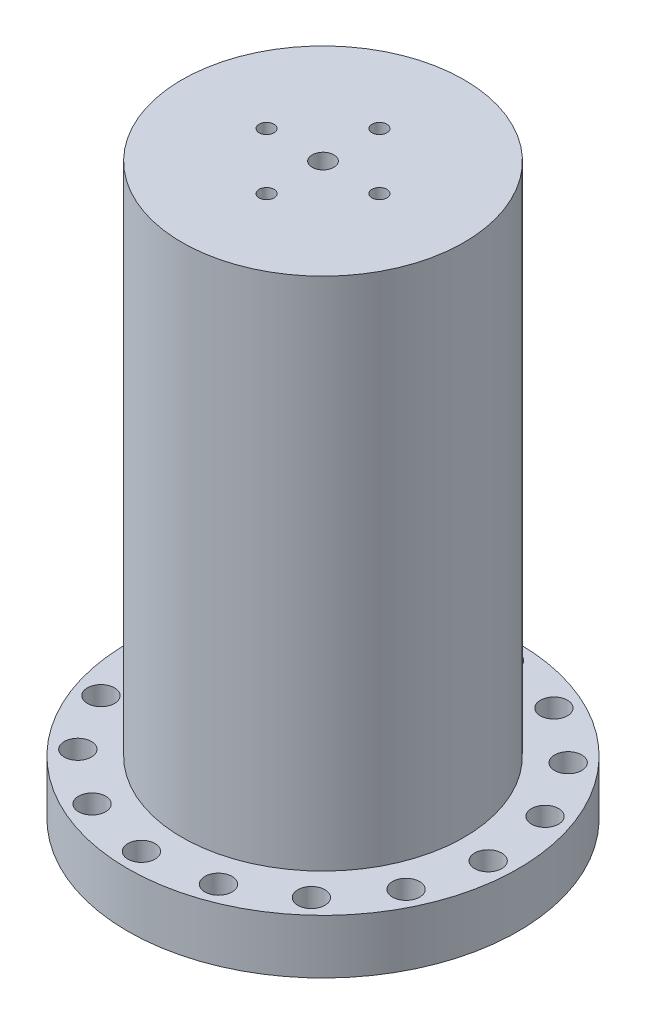
ISO-10303-21;
HEADER;
FILE_DESCRIPTION(('STEP AP214'),'2;1');
FILE_NAME('part.step','',(''),(''),'','','');
FILE_SCHEMA(('AUTOMOTIVE_DESIGN { 1 0 10303 214 1 1 1 1 }'));
ENDSEC;
DATA;
#1=APPLICATION_CONTEXT('core data for automotive mechanical design processes');
#2=APPLICATION_PROTOCOL_DEFINITION('international standard','automotive_design',2000,#1);
#3=PRODUCT_CONTEXT('',#1,'mechanical');
#4=PRODUCT('Part','Part','',(#3));
#5=PRODUCT_RELATED_PRODUCT_CATEGORY('part','',(#4));
#6=PRODUCT_DEFINITION_FORMATION('','',#4);
#7=PRODUCT_DEFINITION_CONTEXT('part definition',#1,'design');
#8=PRODUCT_DEFINITION('design','',#6,#7);
#9=PRODUCT_DEFINITION_SHAPE('','',#8);
#10=(LENGTH_UNIT() NAMED_UNIT(*) SI_UNIT(.MILLI.,.METRE.));
#11=(NAMED_UNIT(*) PLANE_ANGLE_UNIT() SI_UNIT($,.RADIAN.));
#12=(NAMED_UNIT(*) SI_UNIT($,.STERADIAN.) SOLID_ANGLE_UNIT());
#13=UNCERTAINTY_MEASURE_WITH_UNIT(LENGTH_MEASURE(1.E-05),#10,'distance_accuracy_value','');
#14=(GEOMETRIC_REPRESENTATION_CONTEXT(3) GLOBAL_UNCERTAINTY_ASSIGNED_CONTEXT((#13)) GLOBAL_UNIT_ASSIGNED_CONTEXT((#10,
#11,#12)) REPRESENTATION_CONTEXT('',''));
#15=CARTESIAN_POINT('',(0.,0.,0.));
#16=DIRECTION('',(0.,0.,1.));
#17=DIRECTION('',(1.,0.,0.));
#18=AXIS2_PLACEMENT_3D('',#15,#16,#17);
#19=CARTESIAN_POINT('',(0.,5.08,0.));
#20=DIRECTION('',(0.,1.,0.));
#21=DIRECTION('',(0.,0.,1.));
#22=AXIS2_PLACEMENT_3D('',#19,#20,#21);
#23=CYLINDRICAL_SURFACE('',#22,2.54);
#24=CARTESIAN_POINT('',(0.,133.35,0.));
#25=DIRECTION('',(0.,1.,0.));
#26=DIRECTION('',(0.,0.,1.));
#27=AXIS2_PLACEMENT_3D('',#24,#25,#26);
#28=CIRCLE('',#27,2.54);
#29=CARTESIAN_POINT('',(0.,133.35,2.54));
#30=VERTEX_POINT('',#29);
#31=EDGE_CURVE('E57',#30,#30,#28,.T.);
#32=ORIENTED_EDGE('',*,*,#31,.T.);
#33=EDGE_LOOP('',(#32));
#34=FACE_BOUND('',#33,.T.);
#35=CARTESIAN_POINT('',(0.,128.397,0.));
#36=DIRECTION('',(0.,-1.,0.));
#37=DIRECTION('',(0.,0.,-1.));
#38=AXIS2_PLACEMENT_3D('',#35,#36,#37);
#39=CIRCLE('',#38,2.54);
#40=CARTESIAN_POINT('',(0.,128.397,-2.54));
#41=VERTEX_POINT('',#40);
#42=EDGE_CURVE('E37',#41,#41,#39,.F.);
#43=ORIENTED_EDGE('',*,*,#42,.F.);
#44=EDGE_LOOP('',(#43));
#45=FACE_BOUND('',#44,.T.);
#46=ADVANCED_FACE('F33',(#34,#45),#23,.F.);
#47=CARTESIAN_POINT('',(0.,12.7,0.));
#48=DIRECTION('',(0.,-1.,0.));
#49=DIRECTION('',(0.,0.,-1.));
#50=AXIS2_PLACEMENT_3D('',#47,#48,#49);
#51=CYLINDRICAL_SURFACE('',#50,45.72);
#52=CARTESIAN_POINT('',(0.,12.7,0.));
#53=DIRECTION('',(0.,1.,0.));
#54=DIRECTION('',(0.,0.,1.));
#55=AXIS2_PLACEMENT_3D('',#52,#53,#54);
#56=CIRCLE('',#55,45.72);
#57=CARTESIAN_POINT('',(0.,12.7,45.72));
#58=VERTEX_POINT('',#57);
#59=EDGE_CURVE('E10',#58,#58,#56,.T.);
#60=ORIENTED_EDGE('',*,*,#59,.F.);
#61=EDGE_LOOP('',(#60));
#62=FACE_BOUND('',#61,.T.);
#63=CARTESIAN_POINT('',(0.,0.,0.));
#64=DIRECTION('',(0.,1.,0.));
#65=DIRECTION('',(0.,0.,1.));
#66=AXIS2_PLACEMENT_3D('',#63,#64,#65);
#67=CIRCLE('',#66,45.72);
#68=CARTESIAN_POINT('',(0.,0.,45.72));
#69=VERTEX_POINT('',#68);
#70=EDGE_CURVE('E41',#69,#69,#67,.T.);
#71=ORIENTED_EDGE('',*,*,#70,.T.);
#72=EDGE_LOOP('',(#71));
#73=FACE_BOUND('',#72,.T.);
#74=ADVANCED_FACE('F35',(#62,#73),#51,.T.);
#75=CARTESIAN_POINT('',(0.,12.7,0.));
#76=DIRECTION('',(0.,1.,0.));
#77=DIRECTION('',(0.,0.,1.));
#78=AXIS2_PLACEMENT_3D('',#75,#76,#77);
#79=PLANE('',#78);
#80=CARTESIAN_POINT('',(17.3100660208484,12.7,-36.7691611864327));
#81=DIRECTION('',(0.,1.,0.));
#82=DIRECTION('',(0.,0.,1.));
#83=AXIS2_PLACEMENT_3D('',#80,#81,#82);
#84=CIRCLE('',#83,3.175);
#85=CARTESIAN_POINT('',(17.3100660208484,12.7,-33.5941611864327));
#86=VERTEX_POINT('',#85);
#87=EDGE_CURVE('E80',#86,#86,#84,.T.);
#88=ORIENTED_EDGE('',*,*,#87,.F.);
#89=EDGE_LOOP('',(#88));
#90=FACE_BOUND('',#89,.T.);
#91=CARTESIAN_POINT('',(30.0633645110903,12.7,-27.345999968429));
#92=DIRECTION('',(0.,1.,0.));
#93=DIRECTION('',(0.,0.,1.));
#94=AXIS2_PLACEMENT_3D('',#91,#92,#93);
#95=CIRCLE('',#94,3.175);
#96=CARTESIAN_POINT('',(30.0633645110903,12.7,-24.170999968429));
#97=VERTEX_POINT('',#96);
#98=EDGE_CURVE('E83',#97,#97,#95,.T.);
#99=ORIENTED_EDGE('',*,*,#98,.F.);
#100=EDGE_LOOP('',(#99));
#101=FACE_BOUND('',#100,.T.);
#102=CARTESIAN_POINT('',(38.2397882795965,12.7,-13.7596581473389));
#103=DIRECTION('',(0.,1.,0.));
#104=DIRECTION('',(0.,0.,1.));
#105=AXIS2_PLACEMENT_3D('',#102,#103,#104);
#106=CIRCLE('',#105,3.175);
#107=CARTESIAN_POINT('',(38.2397882795965,12.7,-10.5846581473389));
#108=VERTEX_POINT('',#107);
#109=EDGE_CURVE('E86',#108,#108,#106,.T.);
#110=ORIENTED_EDGE('',*,*,#109,.F.);
#111=EDGE_LOOP('',(#110));
#112=FACE_BOUND('',#111,.T.);
#113=CARTESIAN_POINT('',(40.5945509270782,12.7,1.92146689507175));
#114=DIRECTION('',(0.,1.,0.));
#115=DIRECTION('',(0.,0.,1.));
#116=AXIS2_PLACEMENT_3D('',#113,#114,#115);
#117=CIRCLE('',#116,3.175);
#118=CARTESIAN_POINT('',(40.5945509270782,12.7,5.09646689507175));
#119=VERTEX_POINT('',#118);
#120=EDGE_CURVE('E89',#119,#119,#117,.T.);
#121=ORIENTED_EDGE('',*,*,#120,.F.);
#122=EDGE_LOOP('',(#121));
#123=FACE_BOUND('',#122,.T.);
#124=CARTESIAN_POINT('',(36.7691611864326,12.7,17.3100660208485));
#125=DIRECTION('',(0.,1.,0.));
#126=DIRECTION('',(0.,0.,1.));
#127=AXIS2_PLACEMENT_3D('',#124,#125,#126);
#128=CIRCLE('',#127,3.175);
#129=CARTESIAN_POINT('',(36.7691611864326,12.7,20.4850660208485));
#130=VERTEX_POINT('',#129);
#131=EDGE_CURVE('E92',#130,#130,#128,.T.);
#132=ORIENTED_EDGE('',*,*,#131,.F.);
#133=EDGE_LOOP('',(#132));
#134=FACE_BOUND('',#133,.T.);
#135=CARTESIAN_POINT('',(27.3459999684289,12.7,30.0633645110904));
#136=DIRECTION('',(0.,1.,0.));
#137=DIRECTION('',(0.,0.,1.));
#138=AXIS2_PLACEMENT_3D('',#135,#136,#137);
#139=CIRCLE('',#138,3.175);
#140=CARTESIAN_POINT('',(27.3459999684289,12.7,33.2383645110904));
#141=VERTEX_POINT('',#140);
#142=EDGE_CURVE('E95',#141,#141,#139,.T.);
#143=ORIENTED_EDGE('',*,*,#142,.F.);
#144=EDGE_LOOP('',(#143));
#145=FACE_BOUND('',#144,.T.);
#146=CARTESIAN_POINT('',(13.7596581473391,12.7,38.2397882795965));
#147=DIRECTION('',(0.,1.,0.));
#148=DIRECTION('',(0.,0.,1.));
#149=AXIS2_PLACEMENT_3D('',#146,#147,#148);
#150=CIRCLE('',#149,3.175);
#151=CARTESIAN_POINT('',(13.7596581473391,12.7,41.4147882795965));
#152=VERTEX_POINT('',#151);
#153=EDGE_CURVE('E98',#152,#152,#150,.T.);
#154=ORIENTED_EDGE('',*,*,#153,.F.);
#155=EDGE_LOOP('',(#154));
#156=FACE_BOUND('',#155,.T.);
#157=CARTESIAN_POINT('',(-1.92146689507189,12.7,40.5945509270782));
#158=DIRECTION('',(0.,1.,0.));
#159=DIRECTION('',(0.,0.,1.));
#160=AXIS2_PLACEMENT_3D('',#157,#158,#159);
#161=CIRCLE('',#160,3.175);
#162=CARTESIAN_POINT('',(-1.92146689507189,12.7,43.7695509270782));
#163=VERTEX_POINT('',#162);
#164=EDGE_CURVE('E101',#163,#163,#161,.T.);
#165=ORIENTED_EDGE('',*,*,#164,.F.);
#166=EDGE_LOOP('',(#165));
#167=FACE_BOUND('',#166,.T.);
#168=CARTESIAN_POINT('',(-17.3100660208487,12.7,36.7691611864326));
#169=DIRECTION('',(0.,1.,0.));
#170=DIRECTION('',(0.,0.,1.));
#171=AXIS2_PLACEMENT_3D('',#168,#169,#170);
#172=CIRCLE('',#171,3.175);
#173=CARTESIAN_POINT('',(-17.3100660208487,12.7,39.9441611864326));
#174=VERTEX_POINT('',#173);
#175=EDGE_CURVE('E104',#174,#174,#172,.T.);
#176=ORIENTED_EDGE('',*,*,#175,.F.);
#177=EDGE_LOOP('',(#176));
#178=FACE_BOUND('',#177,.T.);
#179=CARTESIAN_POINT('',(-30.0633645110905,12.7,27.3459999684288));
#180=DIRECTION('',(0.,1.,0.));
#181=DIRECTION('',(0.,0.,1.));
#182=AXIS2_PLACEMENT_3D('',#179,#180,#181);
#183=CIRCLE('',#182,3.175);
#184=CARTESIAN_POINT('',(-30.0633645110905,12.7,30.5209999684288));
#185=VERTEX_POINT('',#184);
#186=EDGE_CURVE('E107',#185,#185,#183,.T.);
#187=ORIENTED_EDGE('',*,*,#186,.F.);
#188=EDGE_LOOP('',(#187));
#189=FACE_BOUND('',#188,.T.);
#190=CARTESIAN_POINT('',(-38.2397882795966,12.7,13.7596581473387));
#191=DIRECTION('',(0.,1.,0.));
#192=DIRECTION('',(0.,0.,1.));
#193=AXIS2_PLACEMENT_3D('',#190,#191,#192);
#194=CIRCLE('',#193,3.175);
#195=CARTESIAN_POINT('',(-38.2397882795966,12.7,16.9346581473387));
#196=VERTEX_POINT('',#195);
#197=EDGE_CURVE('E110',#196,#196,#194,.T.);
#198=ORIENTED_EDGE('',*,*,#197,.F.);
#199=EDGE_LOOP('',(#198));
#200=FACE_BOUND('',#199,.T.);
#201=CARTESIAN_POINT('',(-40.5945509270782,12.7,-1.92146689507201));
#202=DIRECTION('',(0.,1.,0.));
#203=DIRECTION('',(0.,0.,1.));
#204=AXIS2_PLACEMENT_3D('',#201,#202,#203);
#205=CIRCLE('',#204,3.175);
#206=CARTESIAN_POINT('',(-40.5945509270782,12.7,1.25353310492799));
#207=VERTEX_POINT('',#206);
#208=EDGE_CURVE('E113',#207,#207,#205,.T.);
#209=ORIENTED_EDGE('',*,*,#208,.F.);
#210=EDGE_LOOP('',(#209));
#211=FACE_BOUND('',#210,.T.);
#212=CARTESIAN_POINT('',(-36.7691611864325,12.7,-17.3100660208488));
#213=DIRECTION('',(0.,1.,0.));
#214=DIRECTION('',(0.,0.,1.));
#215=AXIS2_PLACEMENT_3D('',#212,#213,#214);
#216=CIRCLE('',#215,3.175);
#217=CARTESIAN_POINT('',(-36.7691611864325,12.7,-14.1350660208488));
#218=VERTEX_POINT('',#217);
#219=EDGE_CURVE('E116',#218,#218,#216,.T.);
#220=ORIENTED_EDGE('',*,*,#219,.F.);
#221=EDGE_LOOP('',(#220));
#222=FACE_BOUND('',#221,.T.);
#223=CARTESIAN_POINT('',(-27.3459999684287,12.7,-30.0633645110906));
#224=DIRECTION('',(0.,1.,0.));
#225=DIRECTION('',(0.,0.,1.));
#226=AXIS2_PLACEMENT_3D('',#223,#224,#225);
#227=CIRCLE('',#226,3.175);
#228=CARTESIAN_POINT('',(-27.3459999684287,12.7,-26.8883645110906));
#229=VERTEX_POINT('',#228);
#230=EDGE_CURVE('E119',#229,#229,#227,.T.);
#231=ORIENTED_EDGE('',*,*,#230,.F.);
#232=EDGE_LOOP('',(#231));
#233=FACE_BOUND('',#232,.T.);
#234=CARTESIAN_POINT('',(1.9214668950716,12.7,-40.5945509270782));
#235=DIRECTION('',(0.,1.,0.));
#236=DIRECTION('',(0.,0.,1.));
#237=AXIS2_PLACEMENT_3D('',#234,#235,#236);
#238=CIRCLE('',#237,3.175);
#239=CARTESIAN_POINT('',(1.9214668950716,12.7,-37.4195509270782));
#240=VERTEX_POINT('',#239);
#241=EDGE_CURVE('E72',#240,#240,#238,.T.);
#242=ORIENTED_EDGE('',*,*,#241,.F.);
#243=EDGE_LOOP('',(#242));
#244=FACE_BOUND('',#243,.T.);
#245=CARTESIAN_POINT('',(-13.7596581473391,12.7,-38.2397882795965));
#246=DIRECTION('',(0.,1.,0.));
#247=DIRECTION('',(0.,0.,1.));
#248=AXIS2_PLACEMENT_3D('',#245,#246,#247);
#249=CIRCLE('',#248,3.175);
#250=CARTESIAN_POINT('',(-13.7596581473391,12.7,-35.0647882795965));
#251=VERTEX_POINT('',#250);
#252=EDGE_CURVE('E62',#251,#251,#249,.T.);
#253=ORIENTED_EDGE('',*,*,#252,.F.);
#254=EDGE_LOOP('',(#253));
#255=FACE_BOUND('',#254,.T.);
#256=CARTESIAN_POINT('',(0.,12.7,0.));
#257=DIRECTION('',(0.,1.,0.));
#258=DIRECTION('',(0.,0.,1.));
#259=AXIS2_PLACEMENT_3D('',#256,#257,#258);
#260=CIRCLE('',#259,33.02);
#261=CARTESIAN_POINT('',(0.,12.7,-33.02));
#262=VERTEX_POINT('',#261);
#263=EDGE_CURVE('E48',#262,#262,#260,.T.);
#264=ORIENTED_EDGE('',*,*,#263,.F.);
#265=EDGE_LOOP('',(#264));
#266=FACE_BOUND('',#265,.T.);
#267=ORIENTED_EDGE('',*,*,#59,.T.);
#268=EDGE_LOOP('',(#267));
#269=FACE_BOUND('',#268,.T.);
#270=ADVANCED_FACE('F224',(#90,#101,#112,#123,#134,#145,#156,#167,#178,#189,#200,#211,#222,#233,
#244,#255,#266,#269),#79,.T.);
#271=CARTESIAN_POINT('',(0.,0.,0.));
#272=DIRECTION('',(0.,1.,0.));
#273=DIRECTION('',(0.,0.,1.));
#274=AXIS2_PLACEMENT_3D('',#271,#272,#273);
#275=PLANE('',#274);
#276=CARTESIAN_POINT('',(17.3100660208484,0.,-36.7691611864327));
#277=DIRECTION('',(0.,-1.,0.));
#278=DIRECTION('',(0.707106781186549,0.,-0.707106781186546));
#279=AXIS2_PLACEMENT_3D('',#276,#277,#278);
#280=CIRCLE('',#279,3.175);
#281=CARTESIAN_POINT('',(19.5551300511157,0.,-39.0142252167));
#282=VERTEX_POINT('',#281);
#283=EDGE_CURVE('E122',#282,#282,#280,.T.);
#284=ORIENTED_EDGE('',*,*,#283,.F.);
#285=EDGE_LOOP('',(#284));
#286=FACE_BOUND('',#285,.T.);
#287=CARTESIAN_POINT('',(30.0633645110903,0.,-27.345999968429));
#288=DIRECTION('',(0.,-1.,0.));
#289=DIRECTION('',(0.923879532511288,0.,-0.382683432365087));
#290=AXIS2_PLACEMENT_3D('',#287,#288,#289);
#291=CIRCLE('',#290,3.175);
#292=CARTESIAN_POINT('',(32.9966820268136,0.,-28.5610198661881));
#293=VERTEX_POINT('',#292);
#294=EDGE_CURVE('E160',#293,#293,#291,.T.);
#295=ORIENTED_EDGE('',*,*,#294,.F.);
#296=EDGE_LOOP('',(#295));
#297=FACE_BOUND('',#296,.T.);
#298=CARTESIAN_POINT('',(38.2397882795965,0.,-13.7596581473389));
#299=DIRECTION('',(0.,-1.,0.));
#300=DIRECTION('',(1.,0.,0.));
#301=AXIS2_PLACEMENT_3D('',#298,#299,#300);
#302=CIRCLE('',#301,3.175);
#303=CARTESIAN_POINT('',(41.4147882795965,0.,-13.7596581473389));
#304=VERTEX_POINT('',#303);
#305=EDGE_CURVE('E157',#304,#304,#302,.T.);
#306=ORIENTED_EDGE('',*,*,#305,.F.);
#307=EDGE_LOOP('',(#306));
#308=FACE_BOUND('',#307,.T.);
#309=CARTESIAN_POINT('',(40.5945509270782,0.,1.92146689507175));
#310=DIRECTION('',(0.,-1.,0.));
#311=DIRECTION('',(0.923879532511285,0.,0.382683432365094));
#312=AXIS2_PLACEMENT_3D('',#309,#310,#311);
#313=CIRCLE('',#312,3.175);
#314=CARTESIAN_POINT('',(43.5278684428015,0.,3.13648679283092));
#315=VERTEX_POINT('',#314);
#316=EDGE_CURVE('E154',#315,#315,#313,.T.);
#317=ORIENTED_EDGE('',*,*,#316,.F.);
#318=EDGE_LOOP('',(#317));
#319=FACE_BOUND('',#318,.T.);
#320=CARTESIAN_POINT('',(36.7691611864326,0.,17.3100660208485));
#321=DIRECTION('',(0.,-1.,0.));
#322=DIRECTION('',(0.707106781186544,0.,0.707106781186551));
#323=AXIS2_PLACEMENT_3D('',#320,#321,#322);
#324=CIRCLE('',#323,3.175);
#325=CARTESIAN_POINT('',(39.0142252166999,0.,19.5551300511158));
#326=VERTEX_POINT('',#325);
#327=EDGE_CURVE('E151',#326,#326,#324,.T.);
#328=ORIENTED_EDGE('',*,*,#327,.F.);
#329=EDGE_LOOP('',(#328));
#330=FACE_BOUND('',#329,.T.);
#331=CARTESIAN_POINT('',(27.3459999684289,0.,30.0633645110904));
#332=DIRECTION('',(0.,-1.,0.));
#333=DIRECTION('',(0.382683432365084,0.,0.923879532511289));
#334=AXIS2_PLACEMENT_3D('',#331,#332,#333);
#335=CIRCLE('',#334,3.175);
#336=CARTESIAN_POINT('',(28.561019866188,0.,32.9966820268137));
#337=VERTEX_POINT('',#336);
#338=EDGE_CURVE('E148',#337,#337,#335,.T.);
#339=ORIENTED_EDGE('',*,*,#338,.F.);
#340=EDGE_LOOP('',(#339));
#341=FACE_BOUND('',#340,.T.);
#342=CARTESIAN_POINT('',(13.7596581473391,0.,38.2397882795965));
#343=DIRECTION('',(0.,-1.,0.));
#344=DIRECTION('',(0.,0.,1.));
#345=AXIS2_PLACEMENT_3D('',#342,#343,#344);
#346=CIRCLE('',#345,3.175);
#347=CARTESIAN_POINT('',(13.7596581473391,0.,41.4147882795965));
#348=VERTEX_POINT('',#347);
#349=EDGE_CURVE('E145',#348,#348,#346,.T.);
#350=ORIENTED_EDGE('',*,*,#349,.F.);
#351=EDGE_LOOP('',(#350));
#352=FACE_BOUND('',#351,.T.);
#353=CARTESIAN_POINT('',(-1.92146689507189,0.,40.5945509270782));
#354=DIRECTION('',(0.,-1.,0.));
#355=DIRECTION('',(-0.382683432365097,0.,0.923879532511284));
#356=AXIS2_PLACEMENT_3D('',#353,#354,#355);
#357=CIRCLE('',#356,3.175);
#358=CARTESIAN_POINT('',(-3.13648679283107,0.,43.5278684428015));
#359=VERTEX_POINT('',#358);
#360=EDGE_CURVE('E142',#359,#359,#357,.T.);
#361=ORIENTED_EDGE('',*,*,#360,.F.);
#362=EDGE_LOOP('',(#361));
#363=FACE_BOUND('',#362,.T.);
#364=CARTESIAN_POINT('',(-17.3100660208487,0.,36.7691611864326));
#365=DIRECTION('',(0.,-1.,0.));
#366=DIRECTION('',(-0.707106781186554,0.,0.707106781186541));
#367=AXIS2_PLACEMENT_3D('',#364,#365,#366);
#368=CIRCLE('',#367,3.175);
#369=CARTESIAN_POINT('',(-19.555130051116,0.,39.0142252166998));
#370=VERTEX_POINT('',#369);
#371=EDGE_CURVE('E139',#370,#370,#368,.T.);
#372=ORIENTED_EDGE('',*,*,#371,.F.);
#373=EDGE_LOOP('',(#372));
#374=FACE_BOUND('',#373,.T.);
#375=CARTESIAN_POINT('',(-30.0633645110905,0.,27.3459999684288));
#376=DIRECTION('',(0.,-1.,0.));
#377=DIRECTION('',(-0.923879532511291,0.,0.382683432365081));
#378=AXIS2_PLACEMENT_3D('',#375,#376,#377);
#379=CIRCLE('',#378,3.175);
#380=CARTESIAN_POINT('',(-32.9966820268138,0.,28.5610198661879));
#381=VERTEX_POINT('',#380);
#382=EDGE_CURVE('E136',#381,#381,#379,.T.);
#383=ORIENTED_EDGE('',*,*,#382,.F.);
#384=EDGE_LOOP('',(#383));
#385=FACE_BOUND('',#384,.T.);
#386=CARTESIAN_POINT('',(-38.2397882795966,0.,13.7596581473387));
#387=DIRECTION('',(0.,-1.,0.));
#388=DIRECTION('',(-1.,0.,0.));
#389=AXIS2_PLACEMENT_3D('',#386,#387,#388);
#390=CIRCLE('',#389,3.175);
#391=CARTESIAN_POINT('',(-41.4147882795966,0.,13.7596581473386));
#392=VERTEX_POINT('',#391);
#393=EDGE_CURVE('E133',#392,#392,#390,.T.);
#394=ORIENTED_EDGE('',*,*,#393,.F.);
#395=EDGE_LOOP('',(#394));
#396=FACE_BOUND('',#395,.T.);
#397=CARTESIAN_POINT('',(-40.5945509270782,0.,-1.92146689507201));
#398=DIRECTION('',(0.,-1.,0.));
#399=DIRECTION('',(-0.923879532511283,0.,-0.3826834323651));
#400=AXIS2_PLACEMENT_3D('',#397,#398,#399);
#401=CIRCLE('',#400,3.175);
#402=CARTESIAN_POINT('',(-43.5278684428015,0.,-3.1364867928312));
#403=VERTEX_POINT('',#402);
#404=EDGE_CURVE('E130',#403,#403,#401,.T.);
#405=ORIENTED_EDGE('',*,*,#404,.F.);
#406=EDGE_LOOP('',(#405));
#407=FACE_BOUND('',#406,.T.);
#408=CARTESIAN_POINT('',(-36.7691611864325,0.,-17.3100660208488));
#409=DIRECTION('',(0.,-1.,0.));
#410=DIRECTION('',(-0.707106781186539,0.,-0.707106781186556));
#411=AXIS2_PLACEMENT_3D('',#408,#409,#410);
#412=CIRCLE('',#411,3.175);
#413=CARTESIAN_POINT('',(-39.0142252166998,0.,-19.5551300511161));
#414=VERTEX_POINT('',#413);
#415=EDGE_CURVE('E126',#414,#414,#412,.T.);
#416=ORIENTED_EDGE('',*,*,#415,.F.);
#417=EDGE_LOOP('',(#416));
#418=FACE_BOUND('',#417,.T.);
#419=CARTESIAN_POINT('',(-27.3459999684287,0.,-30.0633645110906));
#420=DIRECTION('',(0.,-1.,0.));
#421=DIRECTION('',(-0.382683432365077,0.,-0.923879532511292));
#422=AXIS2_PLACEMENT_3D('',#419,#420,#421);
#423=CIRCLE('',#422,3.175);
#424=CARTESIAN_POINT('',(-28.5610198661878,0.,-32.9966820268139));
#425=VERTEX_POINT('',#424);
#426=EDGE_CURVE('E123',#425,#425,#423,.T.);
#427=ORIENTED_EDGE('',*,*,#426,.F.);
#428=EDGE_LOOP('',(#427));
#429=FACE_BOUND('',#428,.T.);
#430=CARTESIAN_POINT('',(1.9214668950716,0.,-40.5945509270782));
#431=DIRECTION('',(0.,-1.,0.));
#432=DIRECTION('',(0.382683432365091,0.,-0.923879532511287));
#433=AXIS2_PLACEMENT_3D('',#430,#431,#432);
#434=CIRCLE('',#433,3.175);
#435=CARTESIAN_POINT('',(3.13648679283077,0.,-43.5278684428015));
#436=VERTEX_POINT('',#435);
#437=EDGE_CURVE('E77',#436,#436,#434,.T.);
#438=ORIENTED_EDGE('',*,*,#437,.F.);
#439=EDGE_LOOP('',(#438));
#440=FACE_BOUND('',#439,.T.);
#441=CARTESIAN_POINT('',(-13.7596581473391,0.,-38.2397882795965));
#442=DIRECTION('',(0.,-1.,0.));
#443=DIRECTION('',(0.,0.,-1.));
#444=AXIS2_PLACEMENT_3D('',#441,#442,#443);
#445=CIRCLE('',#444,3.175);
#446=CARTESIAN_POINT('',(-13.7596581473391,0.,-41.4147882795965));
#447=VERTEX_POINT('',#446);
#448=EDGE_CURVE('E65',#447,#447,#445,.T.);
#449=ORIENTED_EDGE('',*,*,#448,.F.);
#450=EDGE_LOOP('',(#449));
#451=FACE_BOUND('',#450,.T.);
#452=CARTESIAN_POINT('',(0.,0.,0.));
#453=DIRECTION('',(0.,-1.,0.));
#454=DIRECTION('',(0.,0.,-1.));
#455=AXIS2_PLACEMENT_3D('',#452,#453,#454);
#456=CIRCLE('',#455,25.4);
#457=CARTESIAN_POINT('',(0.,0.,-25.4));
#458=VERTEX_POINT('',#457);
#459=EDGE_CURVE('E54',#458,#458,#456,.T.);
#460=ORIENTED_EDGE('',*,*,#459,.F.);
#461=EDGE_LOOP('',(#460));
#462=FACE_BOUND('',#461,.T.);
#463=ORIENTED_EDGE('',*,*,#70,.F.);
#464=EDGE_LOOP('',(#463));
#465=FACE_BOUND('',#464,.T.);
#466=ADVANCED_FACE('F220',(#286,#297,#308,#319,#330,#341,#352,#363,#374,#385,#396,#407,#418,
#429,#440,#451,#462,#465),#275,.F.);
#467=CARTESIAN_POINT('',(0.,133.35,0.));
#468=DIRECTION('',(0.,-1.,0.));
#469=DIRECTION('',(0.,0.,-1.));
#470=AXIS2_PLACEMENT_3D('',#467,#468,#469);
#471=CYLINDRICAL_SURFACE('',#470,33.02);
#472=CARTESIAN_POINT('',(0.,133.35,0.));
#473=DIRECTION('',(0.,1.,0.));
#474=DIRECTION('',(0.,0.,1.));
#475=AXIS2_PLACEMENT_3D('',#472,#473,#474);
#476=CIRCLE('',#475,33.02);
#477=CARTESIAN_POINT('',(0.,133.35,-33.02));
#478=VERTEX_POINT('',#477);
#479=EDGE_CURVE('E46',#478,#478,#476,.T.);
#480=CARTESIAN_POINT('',(0.,133.35,-33.02));
#481=CARTESIAN_POINT('',(0.,132.093229166667,-33.02));
#482=CARTESIAN_POINT('',(0.,130.836458333333,-33.02));
#483=CARTESIAN_POINT('',(0.,128.322916666667,-33.02));
#484=CARTESIAN_POINT('',(0.,127.066145833333,-33.02));
#485=CARTESIAN_POINT('',(0.,124.552604166667,-33.02));
#486=CARTESIAN_POINT('',(0.,123.295833333333,-33.02));
#487=CARTESIAN_POINT('',(0.,120.782291666667,-33.02));
#488=CARTESIAN_POINT('',(0.,119.525520833333,-33.02));
#489=CARTESIAN_POINT('',(0.,117.011979166667,-33.02));
#490=CARTESIAN_POINT('',(0.,115.755208333333,-33.02));
#491=CARTESIAN_POINT('',(0.,113.241666666667,-33.02));
#492=CARTESIAN_POINT('',(0.,111.984895833333,-33.02));
#493=CARTESIAN_POINT('',(0.,109.471354166667,-33.02));
#494=CARTESIAN_POINT('',(0.,108.214583333333,-33.02));
#495=CARTESIAN_POINT('',(0.,105.701041666667,-33.02));
#496=CARTESIAN_POINT('',(0.,104.444270833333,-33.02));
#497=CARTESIAN_POINT('',(0.,101.930729166667,-33.02));
#498=CARTESIAN_POINT('',(0.,100.673958333333,-33.02));
#499=CARTESIAN_POINT('',(0.,98.1604166666666,-33.02));
#500=CARTESIAN_POINT('',(0.,96.9036458333333,-33.02));
#501=CARTESIAN_POINT('',(0.,94.3901041666667,-33.02));
#502=CARTESIAN_POINT('',(0.,93.1333333333333,-33.02));
#503=CARTESIAN_POINT('',(0.,90.6197916666667,-33.02));
#504=CARTESIAN_POINT('',(0.,89.3630208333333,-33.02));
#505=CARTESIAN_POINT('',(0.,86.8494791666667,-33.02));
#506=CARTESIAN_POINT('',(0.,85.5927083333333,-33.02));
#507=CARTESIAN_POINT('',(0.,83.0791666666667,-33.02));
#508=CARTESIAN_POINT('',(0.,81.8223958333333,-33.02));
#509=CARTESIAN_POINT('',(0.,79.3088541666667,-33.02));
#510=CARTESIAN_POINT('',(0.,78.0520833333333,-33.02));
#511=CARTESIAN_POINT('',(0.,75.5385416666667,-33.02));
#512=CARTESIAN_POINT('',(0.,74.2817708333333,-33.02));
#513=CARTESIAN_POINT('',(0.,71.7682291666667,-33.02));
#514=CARTESIAN_POINT('',(0.,70.5114583333333,-33.02));
#515=CARTESIAN_POINT('',(0.,67.9979166666667,-33.02));
#516=CARTESIAN_POINT('',(0.,66.7411458333333,-33.02));
#517=CARTESIAN_POINT('',(0.,64.2276041666667,-33.02));
#518=CARTESIAN_POINT('',(0.,62.9708333333333,-33.02));
#519=CARTESIAN_POINT('',(0.,60.4572916666667,-33.02));
#520=CARTESIAN_POINT('',(0.,59.2005208333333,-33.02));
#521=CARTESIAN_POINT('',(0.,56.6869791666667,-33.02));
#522=CARTESIAN_POINT('',(0.,55.4302083333333,-33.02));
#523=CARTESIAN_POINT('',(0.,52.9166666666667,-33.02));
#524=CARTESIAN_POINT('',(0.,51.6598958333333,-33.02));
#525=CARTESIAN_POINT('',(0.,49.1463541666667,-33.02));
#526=CARTESIAN_POINT('',(0.,47.8895833333333,-33.02));
#527=CARTESIAN_POINT('',(0.,45.3760416666667,-33.02));
#528=CARTESIAN_POINT('',(0.,44.1192708333333,-33.02));
#529=CARTESIAN_POINT('',(0.,41.6057291666667,-33.02));
#530=CARTESIAN_POINT('',(0.,40.3489583333333,-33.02));
#531=CARTESIAN_POINT('',(0.,37.8354166666667,-33.02));
#532=CARTESIAN_POINT('',(0.,36.5786458333333,-33.02));
#533=CARTESIAN_POINT('',(0.,34.0651041666667,-33.02));
#534=CARTESIAN_POINT('',(0.,32.8083333333333,-33.02));
#535=CARTESIAN_POINT('',(0.,30.2947916666667,-33.02));
#536=CARTESIAN_POINT('',(0.,29.0380208333333,-33.02));
#537=CARTESIAN_POINT('',(0.,26.5244791666667,-33.02));
#538=CARTESIAN_POINT('',(0.,25.2677083333333,-33.02));
#539=CARTESIAN_POINT('',(0.,22.7541666666667,-33.02));
#540=CARTESIAN_POINT('',(0.,21.4973958333333,-33.02));
#541=CARTESIAN_POINT('',(0.,18.9838541666667,-33.02));
#542=CARTESIAN_POINT('',(0.,17.7270833333333,-33.02));
#543=CARTESIAN_POINT('',(0.,15.2135416666667,-33.02));
#544=CARTESIAN_POINT('',(0.,13.9567708333333,-33.02));
#545=CARTESIAN_POINT('',(0.,12.7,-33.02));
#546=B_SPLINE_CURVE_WITH_KNOTS('',3,(#480,#481,#482,#483,#484,#485,#486,#487,#488,#489,#490,
#491,#492,#493,#494,#495,#496,#497,#498,#499,#500,#501,#502,#503,#504,#505,#506,#507,#508,#509,
#510,#511,#512,#513,#514,#515,#516,#517,#518,#519,#520,#521,#522,#523,#524,#525,#526,#527,#528,
#529,#530,#531,#532,#533,#534,#535,#536,#537,#538,#539,#540,#541,#542,#543,#544,#545),
.UNSPECIFIED.,.F.,.F.,(4,2,2,2,2,2,2,2,2,2,2,2,2,2,2,2,2,2,2,2,2,2,2,2,2,2,2,2,2,2,2,2,4),(0.,
3.77031249999998,7.540625,11.3109375,15.08125,18.8515625,22.621875,26.3921875,30.1625,
33.9328125,37.703125,41.4734375,45.24375,49.0140625,52.784375,56.5546875,60.325,64.0953125,
67.865625,71.6359375,75.40625,79.1765625,82.946875,86.7171875,90.4875,94.2578125,98.028125,
101.7984375,105.56875,109.3390625,113.109375,116.8796875,120.65),.UNSPECIFIED.);
#547=EDGE_CURVE('BSEAM223',#478,#262,#546,.T.);
#548=ORIENTED_EDGE('',*,*,#479,.F.);
#549=ORIENTED_EDGE('',*,*,#263,.T.);
#550=ORIENTED_EDGE('',*,*,#547,.T.);
#551=ORIENTED_EDGE('',*,*,#547,.F.);
#552=EDGE_LOOP('',(#548,#550,#549,#551));
#553=FACE_BOUND('',#552,.T.);
#554=ADVANCED_FACE('F223',(#553),#471,.T.);
#555=CARTESIAN_POINT('',(0.,133.35,0.));
#556=DIRECTION('',(0.,1.,0.));
#557=DIRECTION('',(0.,0.,1.));
#558=AXIS2_PLACEMENT_3D('',#555,#556,#557);
#559=PLANE('',#558);
#560=CARTESIAN_POINT('',(-13.208,133.35,0.));
#561=DIRECTION('',(0.,-1.,0.));
#562=DIRECTION('',(0.,0.,1.));
#563=AXIS2_PLACEMENT_3D('',#560,#561,#562);
#564=CIRCLE('',#563,1.7526);
#565=CARTESIAN_POINT('',(-13.208,133.35,1.7526));
#566=VERTEX_POINT('',#565);
#567=EDGE_CURVE('E174',#566,#566,#564,.T.);
#568=ORIENTED_EDGE('',*,*,#567,.T.);
#569=EDGE_LOOP('',(#568));
#570=FACE_BOUND('',#569,.T.);
#571=CARTESIAN_POINT('',(1.3834645657032E-13,133.35,-13.208));
#572=DIRECTION('',(0.,-1.,0.));
#573=DIRECTION('',(-1.,0.,0.));
#574=AXIS2_PLACEMENT_3D('',#571,#572,#573);
#575=CIRCLE('',#574,1.7526);
#576=CARTESIAN_POINT('',(-1.75259999999986,133.35,-13.208));
#577=VERTEX_POINT('',#576);
#578=EDGE_CURVE('E180',#577,#577,#575,.T.);
#579=ORIENTED_EDGE('',*,*,#578,.T.);
#580=EDGE_LOOP('',(#579));
#581=FACE_BOUND('',#580,.T.);
#582=CARTESIAN_POINT('',(0.,133.35,13.208));
#583=DIRECTION('',(0.,-1.,0.));
#584=DIRECTION('',(1.,0.,0.));
#585=AXIS2_PLACEMENT_3D('',#582,#583,#584);
#586=CIRCLE('',#585,1.7526);
#587=CARTESIAN_POINT('',(1.75259999999995,133.35,13.208));
#588=VERTEX_POINT('',#587);
#589=EDGE_CURVE('E168',#588,#588,#586,.T.);
#590=ORIENTED_EDGE('',*,*,#589,.T.);
#591=EDGE_LOOP('',(#590));
#592=FACE_BOUND('',#591,.T.);
#593=CARTESIAN_POINT('',(13.208,133.35,0.));
#594=DIRECTION('',(0.,-1.,0.));
#595=DIRECTION('',(0.,0.,-1.));
#596=AXIS2_PLACEMENT_3D('',#593,#594,#595);
#597=CIRCLE('',#596,1.7526);
#598=CARTESIAN_POINT('',(13.208,133.35,-1.7526));
#599=VERTEX_POINT('',#598);
#600=EDGE_CURVE('E127',#599,#599,#597,.T.);
#601=ORIENTED_EDGE('',*,*,#600,.T.);
#602=EDGE_LOOP('',(#601));
#603=FACE_BOUND('',#602,.T.);
#604=ORIENTED_EDGE('',*,*,#31,.F.);
#605=EDGE_LOOP('',(#604));
#606=FACE_BOUND('',#605,.T.);
#607=ORIENTED_EDGE('',*,*,#479,.T.);
#608=EDGE_LOOP('',(#607));
#609=FACE_BOUND('',#608,.T.);
#610=ADVANCED_FACE('F189',(#570,#581,#592,#603,#606,#609),#559,.T.);
#611=CARTESIAN_POINT('',(0.,128.27,0.));
#612=DIRECTION('',(0.,-1.,0.));
#613=DIRECTION('',(0.,0.,-1.));
#614=AXIS2_PLACEMENT_3D('',#611,#612,#613);
#615=CYLINDRICAL_SURFACE('',#614,25.4);
#616=CARTESIAN_POINT('',(0.,128.27,0.));
#617=DIRECTION('',(0.,-1.,0.));
#618=DIRECTION('',(0.,0.,-1.));
#619=AXIS2_PLACEMENT_3D('',#616,#617,#618);
#620=CIRCLE('',#619,25.4);
#621=CARTESIAN_POINT('',(0.,128.27,-25.4));
#622=VERTEX_POINT('',#621);
#623=EDGE_CURVE('E51',#622,#622,#620,.T.);
#624=ORIENTED_EDGE('',*,*,#623,.F.);
#625=EDGE_LOOP('',(#624));
#626=FACE_BOUND('',#625,.T.);
#627=ORIENTED_EDGE('',*,*,#459,.T.);
#628=EDGE_LOOP('',(#627));
#629=FACE_BOUND('',#628,.T.);
#630=ADVANCED_FACE('F203',(#626,#629),#615,.F.);
#631=CARTESIAN_POINT('',(0.,128.27,0.));
#632=DIRECTION('',(0.,-1.,0.));
#633=DIRECTION('',(0.,0.,-1.));
#634=AXIS2_PLACEMENT_3D('',#631,#632,#633);
#635=PLANE('',#634);
#636=CARTESIAN_POINT('',(-13.208,128.27,0.));
#637=DIRECTION('',(0.,-1.,0.));
#638=DIRECTION('',(0.,0.,1.));
#639=AXIS2_PLACEMENT_3D('',#636,#637,#638);
#640=CIRCLE('',#639,1.7526);
#641=CARTESIAN_POINT('',(-13.208,128.27,1.7526));
#642=VERTEX_POINT('',#641);
#643=EDGE_CURVE('E183',#642,#642,#640,.T.);
#644=ORIENTED_EDGE('',*,*,#643,.F.);
#645=EDGE_LOOP('',(#644));
#646=FACE_BOUND('',#645,.T.);
#647=CARTESIAN_POINT('',(1.3834645657032E-13,128.27,-13.208));
#648=DIRECTION('',(0.,-1.,0.));
#649=DIRECTION('',(-1.,0.,0.));
#650=AXIS2_PLACEMENT_3D('',#647,#648,#649);
#651=CIRCLE('',#650,1.7526);
#652=CARTESIAN_POINT('',(-1.75259999999986,128.27,-13.208));
#653=VERTEX_POINT('',#652);
#654=EDGE_CURVE('E177',#653,#653,#651,.T.);
#655=ORIENTED_EDGE('',*,*,#654,.F.);
#656=EDGE_LOOP('',(#655));
#657=FACE_BOUND('',#656,.T.);
#658=CARTESIAN_POINT('',(0.,128.27,13.208));
#659=DIRECTION('',(0.,-1.,0.));
#660=DIRECTION('',(1.,0.,0.));
#661=AXIS2_PLACEMENT_3D('',#658,#659,#660);
#662=CIRCLE('',#661,1.7526);
#663=CARTESIAN_POINT('',(1.75259999999995,128.27,13.208));
#664=VERTEX_POINT('',#663);
#665=EDGE_CURVE('E171',#664,#664,#662,.T.);
#666=ORIENTED_EDGE('',*,*,#665,.F.);
#667=EDGE_LOOP('',(#666));
#668=FACE_BOUND('',#667,.T.);
#669=CARTESIAN_POINT('',(13.208,128.27,0.));
#670=DIRECTION('',(0.,-1.,0.));
#671=DIRECTION('',(0.,0.,-1.));
#672=AXIS2_PLACEMENT_3D('',#669,#670,#671);
#673=CIRCLE('',#672,1.7526);
#674=CARTESIAN_POINT('',(13.208,128.27,-1.7526));
#675=VERTEX_POINT('',#674);
#676=EDGE_CURVE('E165',#675,#675,#673,.T.);
#677=ORIENTED_EDGE('',*,*,#676,.F.);
#678=EDGE_LOOP('',(#677));
#679=FACE_BOUND('',#678,.T.);
#680=CARTESIAN_POINT('',(0.,128.27,0.));
#681=DIRECTION('',(0.,-1.,0.));
#682=DIRECTION('',(0.,0.,-1.));
#683=AXIS2_PLACEMENT_3D('',#680,#681,#682);
#684=CIRCLE('',#683,10.16);
#685=CARTESIAN_POINT('',(0.,128.27,-10.16));
#686=VERTEX_POINT('',#685);
#687=EDGE_CURVE('E68',#686,#686,#684,.T.);
#688=ORIENTED_EDGE('',*,*,#687,.F.);
#689=EDGE_LOOP('',(#688));
#690=FACE_BOUND('',#689,.T.);
#691=ORIENTED_EDGE('',*,*,#623,.T.);
#692=EDGE_LOOP('',(#691));
#693=FACE_BOUND('',#692,.T.);
#694=ADVANCED_FACE('F199',(#646,#657,#668,#679,#690,#693),#635,.T.);
#695=CARTESIAN_POINT('',(-13.7596581473391,128.27,-38.2397882795965));
#696=DIRECTION('',(0.,-1.,0.));
#697=DIRECTION('',(0.,0.,-1.));
#698=AXIS2_PLACEMENT_3D('',#695,#696,#697);
#699=CYLINDRICAL_SURFACE('',#698,3.175);
#700=ORIENTED_EDGE('',*,*,#252,.T.);
#701=EDGE_LOOP('',(#700));
#702=FACE_BOUND('',#701,.T.);
#703=ORIENTED_EDGE('',*,*,#448,.T.);
#704=EDGE_LOOP('',(#703));
#705=FACE_BOUND('',#704,.T.);
#706=ADVANCED_FACE('F202',(#702,#705),#699,.F.);
#707=CARTESIAN_POINT('',(0.,128.397,0.));
#708=DIRECTION('',(0.,-1.,0.));
#709=DIRECTION('',(0.,0.,-1.));
#710=AXIS2_PLACEMENT_3D('',#707,#708,#709);
#711=PLANE('',#710);
#712=CARTESIAN_POINT('',(0.,128.397,0.));
#713=DIRECTION('',(0.,-1.,0.));
#714=DIRECTION('',(0.,0.,-1.));
#715=AXIS2_PLACEMENT_3D('',#712,#713,#714);
#716=CIRCLE('',#715,10.16);
#717=CARTESIAN_POINT('',(0.,128.397,-10.16));
#718=VERTEX_POINT('',#717);
#719=EDGE_CURVE('E71',#718,#718,#716,.T.);
#720=ORIENTED_EDGE('',*,*,#719,.T.);
#721=EDGE_LOOP('',(#720));
#722=FACE_BOUND('',#721,.T.);
#723=ORIENTED_EDGE('',*,*,#42,.T.);
#724=EDGE_LOOP('',(#723));
#725=FACE_BOUND('',#724,.T.);
#726=ADVANCED_FACE('F277',(#722,#725),#711,.T.);
#727=CARTESIAN_POINT('',(0.,128.397,0.));
#728=DIRECTION('',(0.,-1.,0.));
#729=DIRECTION('',(0.,0.,-1.));
#730=AXIS2_PLACEMENT_3D('',#727,#728,#729);
#731=CYLINDRICAL_SURFACE('',#730,10.16);
#732=ORIENTED_EDGE('',*,*,#719,.F.);
#733=EDGE_LOOP('',(#732));
#734=FACE_BOUND('',#733,.T.);
#735=ORIENTED_EDGE('',*,*,#687,.T.);
#736=EDGE_LOOP('',(#735));
#737=FACE_BOUND('',#736,.T.);
#738=ADVANCED_FACE('F284',(#734,#737),#731,.F.);
#739=CARTESIAN_POINT('',(1.9214668950716,128.27,-40.5945509270782));
#740=DIRECTION('',(0.,-1.,0.));
#741=DIRECTION('',(0.,0.,-1.));
#742=AXIS2_PLACEMENT_3D('',#739,#740,#741);
#743=CYLINDRICAL_SURFACE('',#742,3.175);
#744=ORIENTED_EDGE('',*,*,#241,.T.);
#745=EDGE_LOOP('',(#744));
#746=FACE_BOUND('',#745,.T.);
#747=ORIENTED_EDGE('',*,*,#437,.T.);
#748=EDGE_LOOP('',(#747));
#749=FACE_BOUND('',#748,.T.);
#750=ADVANCED_FACE('F292',(#746,#749),#743,.F.);
#751=CARTESIAN_POINT('',(-27.3459999684287,128.27,-30.0633645110906));
#752=DIRECTION('',(0.,-1.,0.));
#753=DIRECTION('',(0.,0.,-1.));
#754=AXIS2_PLACEMENT_3D('',#751,#752,#753);
#755=CYLINDRICAL_SURFACE('',#754,3.175);
#756=ORIENTED_EDGE('',*,*,#230,.T.);
#757=EDGE_LOOP('',(#756));
#758=FACE_BOUND('',#757,.T.);
#759=ORIENTED_EDGE('',*,*,#426,.T.);
#760=EDGE_LOOP('',(#759));
#761=FACE_BOUND('',#760,.T.);
#762=ADVANCED_FACE('F300',(#758,#761),#755,.F.);
#763=CARTESIAN_POINT('',(-36.7691611864325,128.27,-17.3100660208488));
#764=DIRECTION('',(0.,-1.,0.));
#765=DIRECTION('',(0.,0.,-1.));
#766=AXIS2_PLACEMENT_3D('',#763,#764,#765);
#767=CYLINDRICAL_SURFACE('',#766,3.175);
#768=ORIENTED_EDGE('',*,*,#219,.T.);
#769=EDGE_LOOP('',(#768));
#770=FACE_BOUND('',#769,.T.);
#771=ORIENTED_EDGE('',*,*,#415,.T.);
#772=EDGE_LOOP('',(#771));
#773=FACE_BOUND('',#772,.T.);
#774=ADVANCED_FACE('F308',(#770,#773),#767,.F.);
#775=CARTESIAN_POINT('',(-40.5945509270782,128.27,-1.92146689507201));
#776=DIRECTION('',(0.,-1.,0.));
#777=DIRECTION('',(0.,0.,-1.));
#778=AXIS2_PLACEMENT_3D('',#775,#776,#777);
#779=CYLINDRICAL_SURFACE('',#778,3.175);
#780=ORIENTED_EDGE('',*,*,#208,.T.);
#781=EDGE_LOOP('',(#780));
#782=FACE_BOUND('',#781,.T.);
#783=ORIENTED_EDGE('',*,*,#404,.T.);
#784=EDGE_LOOP('',(#783));
#785=FACE_BOUND('',#784,.T.);
#786=ADVANCED_FACE('F316',(#782,#785),#779,.F.);
#787=CARTESIAN_POINT('',(-38.2397882795966,128.27,13.7596581473387));
#788=DIRECTION('',(0.,-1.,0.));
#789=DIRECTION('',(0.,0.,-1.));
#790=AXIS2_PLACEMENT_3D('',#787,#788,#789);
#791=CYLINDRICAL_SURFACE('',#790,3.175);
#792=ORIENTED_EDGE('',*,*,#197,.T.);
#793=EDGE_LOOP('',(#792));
#794=FACE_BOUND('',#793,.T.);
#795=ORIENTED_EDGE('',*,*,#393,.T.);
#796=EDGE_LOOP('',(#795));
#797=FACE_BOUND('',#796,.T.);
#798=ADVANCED_FACE('F324',(#794,#797),#791,.F.);
#799=CARTESIAN_POINT('',(-30.0633645110905,128.27,27.3459999684288));
#800=DIRECTION('',(0.,-1.,0.));
#801=DIRECTION('',(0.,0.,-1.));
#802=AXIS2_PLACEMENT_3D('',#799,#800,#801);
#803=CYLINDRICAL_SURFACE('',#802,3.175);
#804=ORIENTED_EDGE('',*,*,#186,.T.);
#805=EDGE_LOOP('',(#804));
#806=FACE_BOUND('',#805,.T.);
#807=ORIENTED_EDGE('',*,*,#382,.T.);
#808=EDGE_LOOP('',(#807));
#809=FACE_BOUND('',#808,.T.);
#810=ADVANCED_FACE('F332',(#806,#809),#803,.F.);
#811=CARTESIAN_POINT('',(-17.3100660208487,128.27,36.7691611864326));
#812=DIRECTION('',(0.,-1.,0.));
#813=DIRECTION('',(0.,0.,-1.));
#814=AXIS2_PLACEMENT_3D('',#811,#812,#813);
#815=CYLINDRICAL_SURFACE('',#814,3.175);
#816=ORIENTED_EDGE('',*,*,#175,.T.);
#817=EDGE_LOOP('',(#816));
#818=FACE_BOUND('',#817,.T.);
#819=ORIENTED_EDGE('',*,*,#371,.T.);
#820=EDGE_LOOP('',(#819));
#821=FACE_BOUND('',#820,.T.);
#822=ADVANCED_FACE('F340',(#818,#821),#815,.F.);
#823=CARTESIAN_POINT('',(-1.92146689507189,128.27,40.5945509270782));
#824=DIRECTION('',(0.,-1.,0.));
#825=DIRECTION('',(0.,0.,-1.));
#826=AXIS2_PLACEMENT_3D('',#823,#824,#825);
#827=CYLINDRICAL_SURFACE('',#826,3.175);
#828=ORIENTED_EDGE('',*,*,#164,.T.);
#829=EDGE_LOOP('',(#828));
#830=FACE_BOUND('',#829,.T.);
#831=ORIENTED_EDGE('',*,*,#360,.T.);
#832=EDGE_LOOP('',(#831));
#833=FACE_BOUND('',#832,.T.);
#834=ADVANCED_FACE('F348',(#830,#833),#827,.F.);
#835=CARTESIAN_POINT('',(13.7596581473391,128.27,38.2397882795965));
#836=DIRECTION('',(0.,-1.,0.));
#837=DIRECTION('',(0.,0.,-1.));
#838=AXIS2_PLACEMENT_3D('',#835,#836,#837);
#839=CYLINDRICAL_SURFACE('',#838,3.175);
#840=ORIENTED_EDGE('',*,*,#153,.T.);
#841=EDGE_LOOP('',(#840));
#842=FACE_BOUND('',#841,.T.);
#843=ORIENTED_EDGE('',*,*,#349,.T.);
#844=EDGE_LOOP('',(#843));
#845=FACE_BOUND('',#844,.T.);
#846=ADVANCED_FACE('F356',(#842,#845),#839,.F.);
#847=CARTESIAN_POINT('',(27.3459999684289,128.27,30.0633645110904));
#848=DIRECTION('',(0.,-1.,0.));
#849=DIRECTION('',(0.,0.,-1.));
#850=AXIS2_PLACEMENT_3D('',#847,#848,#849);
#851=CYLINDRICAL_SURFACE('',#850,3.175);
#852=ORIENTED_EDGE('',*,*,#142,.T.);
#853=EDGE_LOOP('',(#852));
#854=FACE_BOUND('',#853,.T.);
#855=ORIENTED_EDGE('',*,*,#338,.T.);
#856=EDGE_LOOP('',(#855));
#857=FACE_BOUND('',#856,.T.);
#858=ADVANCED_FACE('F364',(#854,#857),#851,.F.);
#859=CARTESIAN_POINT('',(36.7691611864326,128.27,17.3100660208485));
#860=DIRECTION('',(0.,-1.,0.));
#861=DIRECTION('',(0.,0.,-1.));
#862=AXIS2_PLACEMENT_3D('',#859,#860,#861);
#863=CYLINDRICAL_SURFACE('',#862,3.175);
#864=ORIENTED_EDGE('',*,*,#131,.T.);
#865=EDGE_LOOP('',(#864));
#866=FACE_BOUND('',#865,.T.);
#867=ORIENTED_EDGE('',*,*,#327,.T.);
#868=EDGE_LOOP('',(#867));
#869=FACE_BOUND('',#868,.T.);
#870=ADVANCED_FACE('F372',(#866,#869),#863,.F.);
#871=CARTESIAN_POINT('',(40.5945509270782,128.27,1.92146689507175));
#872=DIRECTION('',(0.,-1.,0.));
#873=DIRECTION('',(0.,0.,-1.));
#874=AXIS2_PLACEMENT_3D('',#871,#872,#873);
#875=CYLINDRICAL_SURFACE('',#874,3.175);
#876=ORIENTED_EDGE('',*,*,#120,.T.);
#877=EDGE_LOOP('',(#876));
#878=FACE_BOUND('',#877,.T.);
#879=ORIENTED_EDGE('',*,*,#316,.T.);
#880=EDGE_LOOP('',(#879));
#881=FACE_BOUND('',#880,.T.);
#882=ADVANCED_FACE('F380',(#878,#881),#875,.F.);
#883=CARTESIAN_POINT('',(38.2397882795965,128.27,-13.7596581473389));
#884=DIRECTION('',(0.,-1.,0.));
#885=DIRECTION('',(0.,0.,-1.));
#886=AXIS2_PLACEMENT_3D('',#883,#884,#885);
#887=CYLINDRICAL_SURFACE('',#886,3.175);
#888=ORIENTED_EDGE('',*,*,#109,.T.);
#889=EDGE_LOOP('',(#888));
#890=FACE_BOUND('',#889,.T.);
#891=ORIENTED_EDGE('',*,*,#305,.T.);
#892=EDGE_LOOP('',(#891));
#893=FACE_BOUND('',#892,.T.);
#894=ADVANCED_FACE('F388',(#890,#893),#887,.F.);
#895=CARTESIAN_POINT('',(30.0633645110903,128.27,-27.345999968429));
#896=DIRECTION('',(0.,-1.,0.));
#897=DIRECTION('',(0.,0.,-1.));
#898=AXIS2_PLACEMENT_3D('',#895,#896,#897);
#899=CYLINDRICAL_SURFACE('',#898,3.175);
#900=ORIENTED_EDGE('',*,*,#98,.T.);
#901=EDGE_LOOP('',(#900));
#902=FACE_BOUND('',#901,.T.);
#903=ORIENTED_EDGE('',*,*,#294,.T.);
#904=EDGE_LOOP('',(#903));
#905=FACE_BOUND('',#904,.T.);
#906=ADVANCED_FACE('F396',(#902,#905),#899,.F.);
#907=CARTESIAN_POINT('',(17.3100660208484,128.27,-36.7691611864327));
#908=DIRECTION('',(0.,-1.,0.));
#909=DIRECTION('',(0.,0.,-1.));
#910=AXIS2_PLACEMENT_3D('',#907,#908,#909);
#911=CYLINDRICAL_SURFACE('',#910,3.175);
#912=ORIENTED_EDGE('',*,*,#87,.T.);
#913=EDGE_LOOP('',(#912));
#914=FACE_BOUND('',#913,.T.);
#915=ORIENTED_EDGE('',*,*,#283,.T.);
#916=EDGE_LOOP('',(#915));
#917=FACE_BOUND('',#916,.T.);
#918=ADVANCED_FACE('F404',(#914,#917),#911,.F.);
#919=CARTESIAN_POINT('',(13.208,133.35,0.));
#920=DIRECTION('',(0.,-1.,0.));
#921=DIRECTION('',(0.,0.,-1.));
#922=AXIS2_PLACEMENT_3D('',#919,#920,#921);
#923=CYLINDRICAL_SURFACE('',#922,1.7526);
#924=ORIENTED_EDGE('',*,*,#600,.F.);
#925=EDGE_LOOP('',(#924));
#926=FACE_BOUND('',#925,.T.);
#927=ORIENTED_EDGE('',*,*,#676,.T.);
#928=EDGE_LOOP('',(#927));
#929=FACE_BOUND('',#928,.T.);
#930=ADVANCED_FACE('F412',(#926,#929),#923,.F.);
#931=CARTESIAN_POINT('',(0.,133.35,13.208));
#932=DIRECTION('',(0.,-1.,0.));
#933=DIRECTION('',(0.,0.,-1.));
#934=AXIS2_PLACEMENT_3D('',#931,#932,#933);
#935=CYLINDRICAL_SURFACE('',#934,1.7526);
#936=ORIENTED_EDGE('',*,*,#589,.F.);
#937=EDGE_LOOP('',(#936));
#938=FACE_BOUND('',#937,.T.);
#939=ORIENTED_EDGE('',*,*,#665,.T.);
#940=EDGE_LOOP('',(#939));
#941=FACE_BOUND('',#940,.T.);
#942=ADVANCED_FACE('F419',(#938,#941),#935,.F.);
#943=CARTESIAN_POINT('',(1.3834645657032E-13,133.35,-13.208));
#944=DIRECTION('',(0.,-1.,0.));
#945=DIRECTION('',(0.,0.,-1.));
#946=AXIS2_PLACEMENT_3D('',#943,#944,#945);
#947=CYLINDRICAL_SURFACE('',#946,1.7526);
#948=ORIENTED_EDGE('',*,*,#578,.F.);
#949=EDGE_LOOP('',(#948));
#950=FACE_BOUND('',#949,.T.);
#951=ORIENTED_EDGE('',*,*,#654,.T.);
#952=EDGE_LOOP('',(#951));
#953=FACE_BOUND('',#952,.T.);
#954=ADVANCED_FACE('F195',(#950,#953),#947,.F.);
#955=CARTESIAN_POINT('',(-13.208,133.35,0.));
#956=DIRECTION('',(0.,-1.,0.));
#957=DIRECTION('',(0.,0.,-1.));
#958=AXIS2_PLACEMENT_3D('',#955,#956,#957);
#959=CYLINDRICAL_SURFACE('',#958,1.7526);
#960=ORIENTED_EDGE('',*,*,#567,.F.);
#961=EDGE_LOOP('',(#960));
#962=FACE_BOUND('',#961,.T.);
#963=ORIENTED_EDGE('',*,*,#643,.T.);
#964=EDGE_LOOP('',(#963));
#965=FACE_BOUND('',#964,.T.);
#966=ADVANCED_FACE('F192',(#962,#965),#959,.F.);
#967=CLOSED_SHELL('',(#46,#74,#270,#466,#554,#610,#630,#694,#706,#726,#738,#750,#762,#774,#786,
#798,#810,#822,#834,#846,#858,#870,#882,#894,#906,#918,#930,#942,#954,#966));
#968=MANIFOLD_SOLID_BREP('B2',#967);
#969=ADVANCED_BREP_SHAPE_REPRESENTATION('',(#18,#968),#14);
#970=SHAPE_DEFINITION_REPRESENTATION(#9,#969);
ENDSEC;
END-ISO-10303-21;
